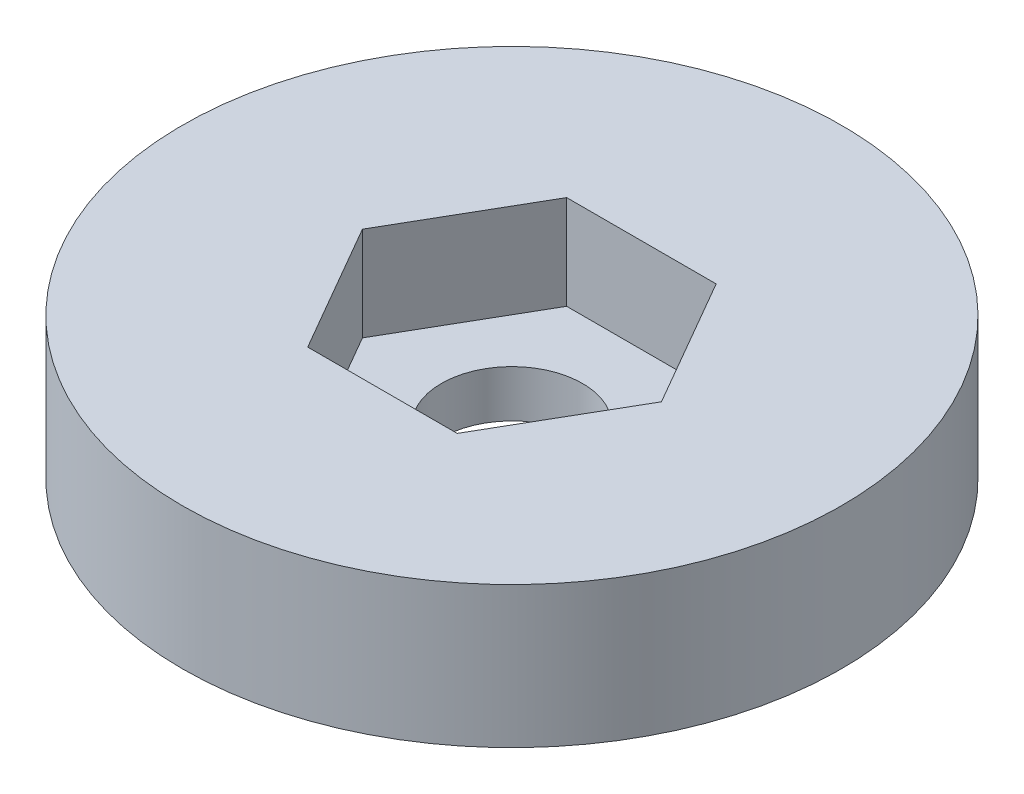
ISO-10303-21;
HEADER;
FILE_DESCRIPTION(('STEP AP214'),'2;1');
FILE_NAME('part.step','',(''),(''),'','','');
FILE_SCHEMA(('AUTOMOTIVE_DESIGN { 1 0 10303 214 1 1 1 1 }'));
ENDSEC;
DATA;
#1=APPLICATION_CONTEXT('core data for automotive mechanical design processes');
#2=APPLICATION_PROTOCOL_DEFINITION('international standard','automotive_design',2000,#1);
#3=PRODUCT_CONTEXT('',#1,'mechanical');
#4=PRODUCT('Part','Part','',(#3));
#5=PRODUCT_RELATED_PRODUCT_CATEGORY('part','',(#4));
#6=PRODUCT_DEFINITION_FORMATION('','',#4);
#7=PRODUCT_DEFINITION_CONTEXT('part definition',#1,'design');
#8=PRODUCT_DEFINITION('design','',#6,#7);
#9=PRODUCT_DEFINITION_SHAPE('','',#8);
#10=(LENGTH_UNIT() NAMED_UNIT(*) SI_UNIT(.MILLI.,.METRE.));
#11=(NAMED_UNIT(*) PLANE_ANGLE_UNIT() SI_UNIT($,.RADIAN.));
#12=(NAMED_UNIT(*) SI_UNIT($,.STERADIAN.) SOLID_ANGLE_UNIT());
#13=UNCERTAINTY_MEASURE_WITH_UNIT(LENGTH_MEASURE(1.E-05),#10,'distance_accuracy_value','');
#14=(GEOMETRIC_REPRESENTATION_CONTEXT(3) GLOBAL_UNCERTAINTY_ASSIGNED_CONTEXT((#13)) GLOBAL_UNIT_ASSIGNED_CONTEXT((#10,
#11,#12)) REPRESENTATION_CONTEXT('',''));
#15=CARTESIAN_POINT('',(0.,0.,0.));
#16=DIRECTION('',(0.,0.,1.));
#17=DIRECTION('',(1.,0.,0.));
#18=AXIS2_PLACEMENT_3D('',#15,#16,#17);
#19=CARTESIAN_POINT('',(0.,3.,0.));
#20=DIRECTION('',(0.,-1.,0.));
#21=DIRECTION('',(0.,0.,-1.));
#22=AXIS2_PLACEMENT_3D('',#19,#20,#21);
#23=CYLINDRICAL_SURFACE('',#22,1.5);
#24=CARTESIAN_POINT('',(0.,0.,0.));
#25=DIRECTION('',(0.,1.,0.));
#26=DIRECTION('',(0.,0.,1.));
#27=AXIS2_PLACEMENT_3D('',#24,#25,#26);
#28=CIRCLE('',#27,1.5);
#29=CARTESIAN_POINT('',(0.,0.,1.5));
#30=VERTEX_POINT('',#29);
#31=EDGE_CURVE('E150',#30,#30,#28,.T.);
#32=ORIENTED_EDGE('',*,*,#31,.F.);
#33=EDGE_LOOP('',(#32));
#34=FACE_BOUND('',#33,.T.);
#35=CARTESIAN_POINT('',(0.,1.,0.));
#36=DIRECTION('',(0.,1.,0.));
#37=DIRECTION('',(0.,0.,1.));
#38=AXIS2_PLACEMENT_3D('',#35,#36,#37);
#39=CIRCLE('',#38,1.5);
#40=CARTESIAN_POINT('',(0.,1.,1.5));
#41=VERTEX_POINT('',#40);
#42=EDGE_CURVE('E45',#41,#41,#39,.T.);
#43=ORIENTED_EDGE('',*,*,#42,.T.);
#44=EDGE_LOOP('',(#43));
#45=FACE_BOUND('',#44,.T.);
#46=ADVANCED_FACE('F41',(#34,#45),#23,.F.);
#47=CARTESIAN_POINT('',(0.,3.,0.));
#48=DIRECTION('',(0.,1.,0.));
#49=DIRECTION('',(0.,0.,1.));
#50=AXIS2_PLACEMENT_3D('',#47,#48,#49);
#51=PLANE('',#50);
#52=DIRECTION('',(-0.5,0.,-0.866025403784438));
#53=VECTOR('',#52,1.);
#54=CARTESIAN_POINT('',(3.17542648054294,3.,0.));
#55=LINE('',#54,#53);
#56=CARTESIAN_POINT('',(3.17542648054294,3.,0.));
#57=VERTEX_POINT('',#56);
#58=CARTESIAN_POINT('',(1.58771324027147,3.,-2.75));
#59=VERTEX_POINT('',#58);
#60=EDGE_CURVE('E58',#57,#59,#55,.T.);
#61=ORIENTED_EDGE('',*,*,#60,.F.);
#62=DIRECTION('',(0.5,0.,-0.866025403784439));
#63=VECTOR('',#62,1.);
#64=CARTESIAN_POINT('',(1.58771324027147,3.,2.75));
#65=LINE('',#64,#63);
#66=CARTESIAN_POINT('',(1.58771324027147,3.,2.75));
#67=VERTEX_POINT('',#66);
#68=EDGE_CURVE('E141',#67,#57,#65,.T.);
#69=ORIENTED_EDGE('',*,*,#68,.F.);
#70=DIRECTION('',(1.,0.,0.));
#71=VECTOR('',#70,1.);
#72=CARTESIAN_POINT('',(-1.58771324027147,3.,2.75));
#73=LINE('',#72,#71);
#74=CARTESIAN_POINT('',(-1.58771324027147,3.,2.75));
#75=VERTEX_POINT('',#74);
#76=EDGE_CURVE('E139',#75,#67,#73,.T.);
#77=ORIENTED_EDGE('',*,*,#76,.F.);
#78=DIRECTION('',(0.5,0.,0.866025403784439));
#79=VECTOR('',#78,1.);
#80=CARTESIAN_POINT('',(-3.17542648054294,3.,0.));
#81=LINE('',#80,#79);
#82=CARTESIAN_POINT('',(-3.17542648054294,3.,0.));
#83=VERTEX_POINT('',#82);
#84=EDGE_CURVE('E106',#83,#75,#81,.T.);
#85=ORIENTED_EDGE('',*,*,#84,.F.);
#86=DIRECTION('',(-0.5,0.,0.866025403784439));
#87=VECTOR('',#86,1.);
#88=CARTESIAN_POINT('',(-1.58771324027147,3.,-2.75));
#89=LINE('',#88,#87);
#90=CARTESIAN_POINT('',(-1.58771324027147,3.,-2.75));
#91=VERTEX_POINT('',#90);
#92=EDGE_CURVE('E135',#91,#83,#89,.T.);
#93=ORIENTED_EDGE('',*,*,#92,.F.);
#94=DIRECTION('',(-1.,0.,0.));
#95=VECTOR('',#94,1.);
#96=CARTESIAN_POINT('',(1.58771324027147,3.,-2.75));
#97=LINE('',#96,#95);
#98=EDGE_CURVE('E132',#59,#91,#97,.T.);
#99=ORIENTED_EDGE('',*,*,#98,.F.);
#100=EDGE_LOOP('',(#61,#69,#77,#85,#93,#99));
#101=FACE_BOUND('',#100,.T.);
#102=CARTESIAN_POINT('',(0.,3.,0.));
#103=DIRECTION('',(0.,1.,0.));
#104=DIRECTION('',(0.,0.,1.));
#105=AXIS2_PLACEMENT_3D('',#102,#103,#104);
#106=CIRCLE('',#105,7.);
#107=CARTESIAN_POINT('',(0.,3.,7.));
#108=VERTEX_POINT('',#107);
#109=EDGE_CURVE('E11',#108,#108,#106,.T.);
#110=ORIENTED_EDGE('',*,*,#109,.T.);
#111=EDGE_LOOP('',(#110));
#112=FACE_BOUND('',#111,.T.);
#113=ADVANCED_FACE('F159',(#101,#112),#51,.T.);
#114=CARTESIAN_POINT('',(0.,0.,0.));
#115=DIRECTION('',(0.,1.,0.));
#116=DIRECTION('',(0.,0.,1.));
#117=AXIS2_PLACEMENT_3D('',#114,#115,#116);
#118=PLANE('',#117);
#119=CARTESIAN_POINT('',(0.,0.,0.));
#120=DIRECTION('',(0.,1.,0.));
#121=DIRECTION('',(0.,0.,1.));
#122=AXIS2_PLACEMENT_3D('',#119,#120,#121);
#123=CIRCLE('',#122,7.);
#124=CARTESIAN_POINT('',(0.,0.,7.));
#125=VERTEX_POINT('',#124);
#126=EDGE_CURVE('E50',#125,#125,#123,.T.);
#127=ORIENTED_EDGE('',*,*,#126,.F.);
#128=EDGE_LOOP('',(#127));
#129=FACE_BOUND('',#128,.T.);
#130=ORIENTED_EDGE('',*,*,#31,.T.);
#131=EDGE_LOOP('',(#130));
#132=FACE_BOUND('',#131,.T.);
#133=ADVANCED_FACE('F156',(#129,#132),#118,.F.);
#134=CARTESIAN_POINT('',(0.,3.,0.));
#135=DIRECTION('',(0.,-1.,0.));
#136=DIRECTION('',(0.,0.,-1.));
#137=AXIS2_PLACEMENT_3D('',#134,#135,#136);
#138=CYLINDRICAL_SURFACE('',#137,7.);
#139=ORIENTED_EDGE('',*,*,#109,.F.);
#140=EDGE_LOOP('',(#139));
#141=FACE_BOUND('',#140,.T.);
#142=ORIENTED_EDGE('',*,*,#126,.T.);
#143=EDGE_LOOP('',(#142));
#144=FACE_BOUND('',#143,.T.);
#145=ADVANCED_FACE('F43',(#141,#144),#138,.T.);
#146=CARTESIAN_POINT('',(3.17542648054294,1.,0.));
#147=DIRECTION('',(0.866025403784438,0.,-0.5));
#148=DIRECTION('',(-0.5,0.,-0.866025403784439));
#149=AXIS2_PLACEMENT_3D('',#146,#147,#148);
#150=PLANE('',#149);
#151=ORIENTED_EDGE('',*,*,#60,.T.);
#152=DIRECTION('',(0.,1.,0.));
#153=VECTOR('',#152,1.);
#154=CARTESIAN_POINT('',(1.58771324027147,1.,-2.75));
#155=LINE('',#154,#153);
#156=CARTESIAN_POINT('',(1.58771324027147,1.,-2.75));
#157=VERTEX_POINT('',#156);
#158=EDGE_CURVE('E88',#157,#59,#155,.T.);
#159=ORIENTED_EDGE('',*,*,#158,.F.);
#160=DIRECTION('',(-0.5,0.,-0.866025403784438));
#161=VECTOR('',#160,1.);
#162=CARTESIAN_POINT('',(3.17542648054294,1.,0.));
#163=LINE('',#162,#161);
#164=CARTESIAN_POINT('',(3.17542648054294,1.,0.));
#165=VERTEX_POINT('',#164);
#166=EDGE_CURVE('E143',#165,#157,#163,.T.);
#167=ORIENTED_EDGE('',*,*,#166,.F.);
#168=DIRECTION('',(0.,1.,0.));
#169=VECTOR('',#168,1.);
#170=CARTESIAN_POINT('',(3.17542648054294,1.,0.));
#171=LINE('',#170,#169);
#172=EDGE_CURVE('E66',#165,#57,#171,.T.);
#173=ORIENTED_EDGE('',*,*,#172,.T.);
#174=EDGE_LOOP('',(#151,#159,#167,#173));
#175=FACE_BOUND('',#174,.T.);
#176=ADVANCED_FACE('F181',(#175),#150,.F.);
#177=CARTESIAN_POINT('',(1.58771324027147,1.,2.75));
#178=DIRECTION('',(0.866025403784439,0.,0.5));
#179=DIRECTION('',(0.5,0.,-0.866025403784439));
#180=AXIS2_PLACEMENT_3D('',#177,#178,#179);
#181=PLANE('',#180);
#182=ORIENTED_EDGE('',*,*,#68,.T.);
#183=ORIENTED_EDGE('',*,*,#172,.F.);
#184=DIRECTION('',(0.5,0.,-0.866025403784439));
#185=VECTOR('',#184,1.);
#186=CARTESIAN_POINT('',(1.58771324027147,1.,2.75));
#187=LINE('',#186,#185);
#188=CARTESIAN_POINT('',(1.58771324027147,1.,2.75));
#189=VERTEX_POINT('',#188);
#190=EDGE_CURVE('E118',#189,#165,#187,.T.);
#191=ORIENTED_EDGE('',*,*,#190,.F.);
#192=DIRECTION('',(0.,1.,0.));
#193=VECTOR('',#192,1.);
#194=CARTESIAN_POINT('',(1.58771324027147,1.,2.75));
#195=LINE('',#194,#193);
#196=EDGE_CURVE('E110',#189,#67,#195,.T.);
#197=ORIENTED_EDGE('',*,*,#196,.T.);
#198=EDGE_LOOP('',(#182,#183,#191,#197));
#199=FACE_BOUND('',#198,.T.);
#200=ADVANCED_FACE('F178',(#199),#181,.F.);
#201=CARTESIAN_POINT('',(-1.58771324027147,1.,2.75));
#202=DIRECTION('',(0.,0.,1.));
#203=DIRECTION('',(1.,0.,0.));
#204=AXIS2_PLACEMENT_3D('',#201,#202,#203);
#205=PLANE('',#204);
#206=ORIENTED_EDGE('',*,*,#76,.T.);
#207=ORIENTED_EDGE('',*,*,#196,.F.);
#208=DIRECTION('',(1.,0.,0.));
#209=VECTOR('',#208,1.);
#210=CARTESIAN_POINT('',(-1.58771324027147,1.,2.75));
#211=LINE('',#210,#209);
#212=CARTESIAN_POINT('',(-1.58771324027147,1.,2.75));
#213=VERTEX_POINT('',#212);
#214=EDGE_CURVE('E114',#213,#189,#211,.T.);
#215=ORIENTED_EDGE('',*,*,#214,.F.);
#216=DIRECTION('',(0.,1.,0.));
#217=VECTOR('',#216,1.);
#218=CARTESIAN_POINT('',(-1.58771324027147,1.,2.75));
#219=LINE('',#218,#217);
#220=EDGE_CURVE('E99',#213,#75,#219,.T.);
#221=ORIENTED_EDGE('',*,*,#220,.T.);
#222=EDGE_LOOP('',(#206,#207,#215,#221));
#223=FACE_BOUND('',#222,.T.);
#224=ADVANCED_FACE('F115',(#223),#205,.F.);
#225=CARTESIAN_POINT('',(-3.17542648054294,1.,0.));
#226=DIRECTION('',(-0.866025403784439,0.,0.5));
#227=DIRECTION('',(0.5,0.,0.866025403784439));
#228=AXIS2_PLACEMENT_3D('',#225,#226,#227);
#229=PLANE('',#228);
#230=ORIENTED_EDGE('',*,*,#84,.T.);
#231=ORIENTED_EDGE('',*,*,#220,.F.);
#232=DIRECTION('',(0.5,0.,0.866025403784439));
#233=VECTOR('',#232,1.);
#234=CARTESIAN_POINT('',(-3.17542648054294,1.,0.));
#235=LINE('',#234,#233);
#236=CARTESIAN_POINT('',(-3.17542648054294,1.,0.));
#237=VERTEX_POINT('',#236);
#238=EDGE_CURVE('E103',#237,#213,#235,.T.);
#239=ORIENTED_EDGE('',*,*,#238,.F.);
#240=DIRECTION('',(0.,1.,0.));
#241=VECTOR('',#240,1.);
#242=CARTESIAN_POINT('',(-3.17542648054294,1.,0.));
#243=LINE('',#242,#241);
#244=EDGE_CURVE('E111',#237,#83,#243,.T.);
#245=ORIENTED_EDGE('',*,*,#244,.T.);
#246=EDGE_LOOP('',(#230,#231,#239,#245));
#247=FACE_BOUND('',#246,.T.);
#248=ADVANCED_FACE('F101',(#247),#229,.F.);
#249=CARTESIAN_POINT('',(-1.58771324027147,1.,-2.75));
#250=DIRECTION('',(-0.866025403784439,0.,-0.5));
#251=DIRECTION('',(-0.5,0.,0.866025403784439));
#252=AXIS2_PLACEMENT_3D('',#249,#250,#251);
#253=PLANE('',#252);
#254=ORIENTED_EDGE('',*,*,#92,.T.);
#255=ORIENTED_EDGE('',*,*,#244,.F.);
#256=DIRECTION('',(-0.5,0.,0.866025403784439));
#257=VECTOR('',#256,1.);
#258=CARTESIAN_POINT('',(-1.58771324027147,1.,-2.75));
#259=LINE('',#258,#257);
#260=CARTESIAN_POINT('',(-1.58771324027147,1.,-2.75));
#261=VERTEX_POINT('',#260);
#262=EDGE_CURVE('E124',#261,#237,#259,.T.);
#263=ORIENTED_EDGE('',*,*,#262,.F.);
#264=DIRECTION('',(0.,1.,0.));
#265=VECTOR('',#264,1.);
#266=CARTESIAN_POINT('',(-1.58771324027147,1.,-2.75));
#267=LINE('',#266,#265);
#268=EDGE_CURVE('E147',#261,#91,#267,.T.);
#269=ORIENTED_EDGE('',*,*,#268,.T.);
#270=EDGE_LOOP('',(#254,#255,#263,#269));
#271=FACE_BOUND('',#270,.T.);
#272=ADVANCED_FACE('F174',(#271),#253,.F.);
#273=CARTESIAN_POINT('',(1.58771324027147,1.,-2.75));
#274=DIRECTION('',(0.,0.,-1.));
#275=DIRECTION('',(-1.,0.,0.));
#276=AXIS2_PLACEMENT_3D('',#273,#274,#275);
#277=PLANE('',#276);
#278=ORIENTED_EDGE('',*,*,#98,.T.);
#279=ORIENTED_EDGE('',*,*,#268,.F.);
#280=DIRECTION('',(-1.,0.,0.));
#281=VECTOR('',#280,1.);
#282=CARTESIAN_POINT('',(1.58771324027147,1.,-2.75));
#283=LINE('',#282,#281);
#284=EDGE_CURVE('E126',#157,#261,#283,.T.);
#285=ORIENTED_EDGE('',*,*,#284,.F.);
#286=ORIENTED_EDGE('',*,*,#158,.T.);
#287=EDGE_LOOP('',(#278,#279,#285,#286));
#288=FACE_BOUND('',#287,.T.);
#289=ADVANCED_FACE('F169',(#288),#277,.F.);
#290=CARTESIAN_POINT('',(0.,1.,0.));
#291=DIRECTION('',(0.,1.,0.));
#292=DIRECTION('',(0.,0.,1.));
#293=AXIS2_PLACEMENT_3D('',#290,#291,#292);
#294=PLANE('',#293);
#295=ORIENTED_EDGE('',*,*,#42,.F.);
#296=EDGE_LOOP('',(#295));
#297=FACE_BOUND('',#296,.T.);
#298=ORIENTED_EDGE('',*,*,#166,.T.);
#299=ORIENTED_EDGE('',*,*,#284,.T.);
#300=ORIENTED_EDGE('',*,*,#262,.T.);
#301=ORIENTED_EDGE('',*,*,#238,.T.);
#302=ORIENTED_EDGE('',*,*,#214,.T.);
#303=ORIENTED_EDGE('',*,*,#190,.T.);
#304=EDGE_LOOP('',(#298,#299,#300,#301,#302,#303));
#305=FACE_BOUND('',#304,.T.);
#306=ADVANCED_FACE('F121',(#297,#305),#294,.T.);
#307=CLOSED_SHELL('',(#46,#113,#133,#145,#176,#200,#224,#248,#272,#289,#306));
#308=MANIFOLD_SOLID_BREP('B2',#307);
#309=ADVANCED_BREP_SHAPE_REPRESENTATION('',(#18,#308),#14);
#310=SHAPE_DEFINITION_REPRESENTATION(#9,#309);
ENDSEC;
END-ISO-10303-21;
